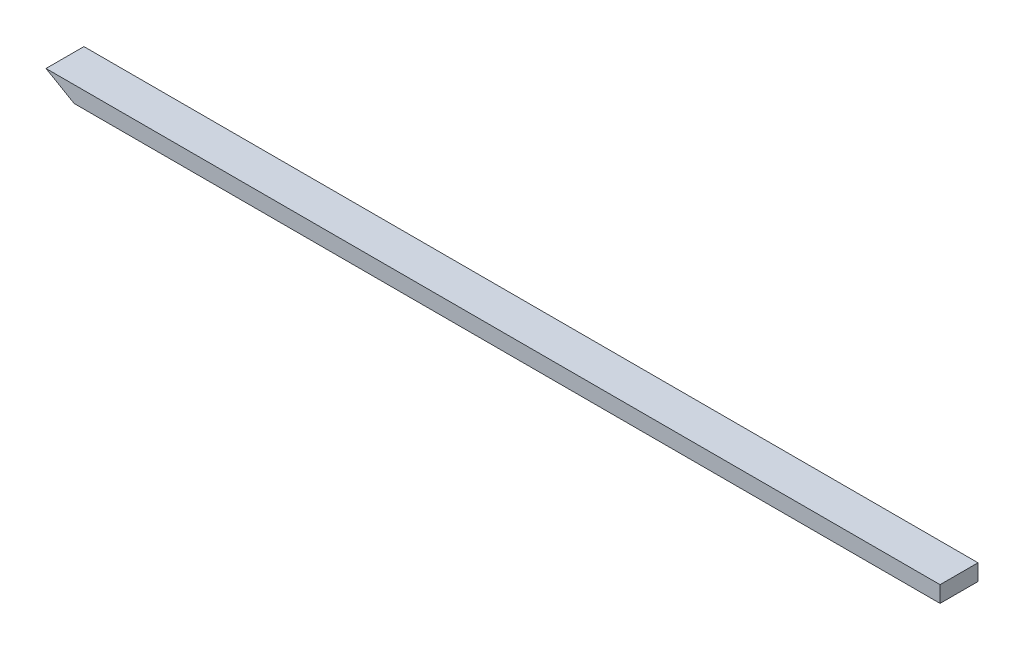
ISO-10303-21;
HEADER;
FILE_DESCRIPTION(('STEP AP214'),'2;1');
FILE_NAME('part.step','',(''),(''),'','','');
FILE_SCHEMA(('AUTOMOTIVE_DESIGN { 1 0 10303 214 1 1 1 1 }'));
ENDSEC;
DATA;
#1=APPLICATION_CONTEXT('core data for automotive mechanical design processes');
#2=APPLICATION_PROTOCOL_DEFINITION('international standard','automotive_design',2000,#1);
#3=PRODUCT_CONTEXT('',#1,'mechanical');
#4=PRODUCT('Part','Part','',(#3));
#5=PRODUCT_RELATED_PRODUCT_CATEGORY('part','',(#4));
#6=PRODUCT_DEFINITION_FORMATION('','',#4);
#7=PRODUCT_DEFINITION_CONTEXT('part definition',#1,'design');
#8=PRODUCT_DEFINITION('design','',#6,#7);
#9=PRODUCT_DEFINITION_SHAPE('','',#8);
#10=(LENGTH_UNIT() NAMED_UNIT(*) SI_UNIT(.MILLI.,.METRE.));
#11=(NAMED_UNIT(*) PLANE_ANGLE_UNIT() SI_UNIT($,.RADIAN.));
#12=(NAMED_UNIT(*) SI_UNIT($,.STERADIAN.) SOLID_ANGLE_UNIT());
#13=UNCERTAINTY_MEASURE_WITH_UNIT(LENGTH_MEASURE(1.E-05),#10,'distance_accuracy_value','');
#14=(GEOMETRIC_REPRESENTATION_CONTEXT(3) GLOBAL_UNCERTAINTY_ASSIGNED_CONTEXT((#13)) GLOBAL_UNIT_ASSIGNED_CONTEXT((#10,
#11,#12)) REPRESENTATION_CONTEXT('',''));
#15=CARTESIAN_POINT('',(0.,0.,0.));
#16=DIRECTION('',(0.,0.,1.));
#17=DIRECTION('',(1.,0.,0.));
#18=AXIS2_PLACEMENT_3D('',#15,#16,#17);
#19=CARTESIAN_POINT('',(1047.75,-19.05,-44.45));
#20=DIRECTION('',(0.,0.,1.));
#21=DIRECTION('',(1.,0.,0.));
#22=AXIS2_PLACEMENT_3D('',#19,#20,#21);
#23=PLANE('',#22);
#24=DIRECTION('',(0.866025403784443,-0.499999999999992,0.));
#25=VECTOR('',#24,1.);
#26=CARTESIAN_POINT('',(-1047.75,19.05,-44.45));
#27=LINE('',#26,#25);
#28=CARTESIAN_POINT('',(-1047.75,19.05,-44.45));
#29=VERTEX_POINT('',#28);
#30=CARTESIAN_POINT('',(-981.758864231624,-19.05,-44.45));
#31=VERTEX_POINT('',#30);
#32=EDGE_CURVE('E93',#29,#31,#27,.T.);
#33=ORIENTED_EDGE('',*,*,#32,.F.);
#34=DIRECTION('',(-1.,0.,0.));
#35=VECTOR('',#34,1.);
#36=CARTESIAN_POINT('',(1047.75,19.05,-44.45));
#37=LINE('',#36,#35);
#38=CARTESIAN_POINT('',(1047.75,19.05,-44.45));
#39=VERTEX_POINT('',#38);
#40=EDGE_CURVE('E11',#39,#29,#37,.T.);
#41=ORIENTED_EDGE('',*,*,#40,.F.);
#42=DIRECTION('',(0.,1.,0.));
#43=VECTOR('',#42,1.);
#44=CARTESIAN_POINT('',(1047.75,-19.05,-44.45));
#45=LINE('',#44,#43);
#46=CARTESIAN_POINT('',(1047.75,-19.05,-44.45));
#47=VERTEX_POINT('',#46);
#48=EDGE_CURVE('E119',#47,#39,#45,.T.);
#49=ORIENTED_EDGE('',*,*,#48,.F.);
#50=DIRECTION('',(-1.,0.,0.));
#51=VECTOR('',#50,1.);
#52=CARTESIAN_POINT('',(1047.75,-19.05,-44.45));
#53=LINE('',#52,#51);
#54=EDGE_CURVE('E111',#47,#31,#53,.T.);
#55=ORIENTED_EDGE('',*,*,#54,.T.);
#56=EDGE_LOOP('',(#33,#41,#49,#55));
#57=FACE_BOUND('',#56,.T.);
#58=ADVANCED_FACE('F47',(#57),#23,.F.);
#59=CARTESIAN_POINT('',(1047.75,-19.05,44.45));
#60=DIRECTION('',(0.,0.,-1.));
#61=DIRECTION('',(-1.,0.,0.));
#62=AXIS2_PLACEMENT_3D('',#59,#60,#61);
#63=PLANE('',#62);
#64=DIRECTION('',(0.866025403784443,-0.499999999999992,0.));
#65=VECTOR('',#64,1.);
#66=CARTESIAN_POINT('',(-1047.75,19.05,44.45));
#67=LINE('',#66,#65);
#68=CARTESIAN_POINT('',(-1047.75,19.05,44.45));
#69=VERTEX_POINT('',#68);
#70=CARTESIAN_POINT('',(-981.758864231624,-19.05,44.45));
#71=VERTEX_POINT('',#70);
#72=EDGE_CURVE('E90',#69,#71,#67,.T.);
#73=ORIENTED_EDGE('',*,*,#72,.T.);
#74=DIRECTION('',(-1.,0.,0.));
#75=VECTOR('',#74,1.);
#76=CARTESIAN_POINT('',(1047.75,-19.05,44.45));
#77=LINE('',#76,#75);
#78=CARTESIAN_POINT('',(1047.75,-19.05,44.45));
#79=VERTEX_POINT('',#78);
#80=EDGE_CURVE('E105',#79,#71,#77,.T.);
#81=ORIENTED_EDGE('',*,*,#80,.F.);
#82=DIRECTION('',(0.,-1.,0.));
#83=VECTOR('',#82,1.);
#84=CARTESIAN_POINT('',(1047.75,-19.05,44.45));
#85=LINE('',#84,#83);
#86=CARTESIAN_POINT('',(1047.75,19.05,44.45));
#87=VERTEX_POINT('',#86);
#88=EDGE_CURVE('E122',#87,#79,#85,.T.);
#89=ORIENTED_EDGE('',*,*,#88,.F.);
#90=DIRECTION('',(-1.,0.,0.));
#91=VECTOR('',#90,1.);
#92=CARTESIAN_POINT('',(1047.75,19.05,44.45));
#93=LINE('',#92,#91);
#94=EDGE_CURVE('E56',#87,#69,#93,.T.);
#95=ORIENTED_EDGE('',*,*,#94,.T.);
#96=EDGE_LOOP('',(#73,#81,#89,#95));
#97=FACE_BOUND('',#96,.T.);
#98=ADVANCED_FACE('F103',(#97),#63,.F.);
#99=CARTESIAN_POINT('',(1047.75,-19.05,44.45));
#100=DIRECTION('',(0.,1.,0.));
#101=DIRECTION('',(0.,0.,1.));
#102=AXIS2_PLACEMENT_3D('',#99,#100,#101);
#103=PLANE('',#102);
#104=DIRECTION('',(0.,0.,1.));
#105=VECTOR('',#104,1.);
#106=CARTESIAN_POINT('',(-981.758864231624,-19.05,-44.45));
#107=LINE('',#106,#105);
#108=EDGE_CURVE('E87',#31,#71,#107,.T.);
#109=ORIENTED_EDGE('',*,*,#108,.F.);
#110=ORIENTED_EDGE('',*,*,#54,.F.);
#111=DIRECTION('',(0.,0.,-1.));
#112=VECTOR('',#111,1.);
#113=CARTESIAN_POINT('',(1047.75,-19.05,44.45));
#114=LINE('',#113,#112);
#115=EDGE_CURVE('E63',#79,#47,#114,.T.);
#116=ORIENTED_EDGE('',*,*,#115,.F.);
#117=ORIENTED_EDGE('',*,*,#80,.T.);
#118=EDGE_LOOP('',(#109,#110,#116,#117));
#119=FACE_BOUND('',#118,.T.);
#120=ADVANCED_FACE('F109',(#119),#103,.F.);
#121=CARTESIAN_POINT('',(1047.75,19.05,44.45));
#122=DIRECTION('',(0.,-1.,0.));
#123=DIRECTION('',(0.,0.,-1.));
#124=AXIS2_PLACEMENT_3D('',#121,#122,#123);
#125=PLANE('',#124);
#126=DIRECTION('',(0.,0.,1.));
#127=VECTOR('',#126,1.);
#128=CARTESIAN_POINT('',(-1047.75,19.05,44.45));
#129=LINE('',#128,#127);
#130=EDGE_CURVE('E98',#29,#69,#129,.T.);
#131=ORIENTED_EDGE('',*,*,#130,.T.);
#132=ORIENTED_EDGE('',*,*,#94,.F.);
#133=DIRECTION('',(0.,0.,1.));
#134=VECTOR('',#133,1.);
#135=CARTESIAN_POINT('',(1047.75,19.05,44.45));
#136=LINE('',#135,#134);
#137=EDGE_CURVE('E125',#39,#87,#136,.T.);
#138=ORIENTED_EDGE('',*,*,#137,.F.);
#139=ORIENTED_EDGE('',*,*,#40,.T.);
#140=EDGE_LOOP('',(#131,#132,#138,#139));
#141=FACE_BOUND('',#140,.T.);
#142=ADVANCED_FACE('F136',(#141),#125,.F.);
#143=CARTESIAN_POINT('',(1047.75,0.,0.));
#144=DIRECTION('',(-1.,0.,0.));
#145=DIRECTION('',(0.,0.,1.));
#146=AXIS2_PLACEMENT_3D('',#143,#144,#145);
#147=PLANE('',#146);
#148=ORIENTED_EDGE('',*,*,#48,.T.);
#149=ORIENTED_EDGE('',*,*,#137,.T.);
#150=ORIENTED_EDGE('',*,*,#88,.T.);
#151=ORIENTED_EDGE('',*,*,#115,.T.);
#152=EDGE_LOOP('',(#148,#149,#150,#151));
#153=FACE_BOUND('',#152,.T.);
#154=ADVANCED_FACE('F133',(#153),#147,.F.);
#155=CARTESIAN_POINT('',(-1047.75,19.05,-44.45));
#156=DIRECTION('',(-0.499999999999992,-0.866025403784443,0.));
#157=DIRECTION('',(0.866025403784443,-0.499999999999992,0.));
#158=AXIS2_PLACEMENT_3D('',#155,#156,#157);
#159=PLANE('',#158);
#160=ORIENTED_EDGE('',*,*,#130,.F.);
#161=ORIENTED_EDGE('',*,*,#32,.T.);
#162=ORIENTED_EDGE('',*,*,#108,.T.);
#163=ORIENTED_EDGE('',*,*,#72,.F.);
#164=EDGE_LOOP('',(#160,#161,#162,#163));
#165=FACE_BOUND('',#164,.T.);
#166=ADVANCED_FACE('F89',(#165),#159,.T.);
#167=CLOSED_SHELL('',(#58,#98,#120,#142,#154,#166));
#168=MANIFOLD_SOLID_BREP('B2',#167);
#169=ADVANCED_BREP_SHAPE_REPRESENTATION('',(#18,#168),#14);
#170=SHAPE_DEFINITION_REPRESENTATION(#9,#169);
ENDSEC;
END-ISO-10303-21;
